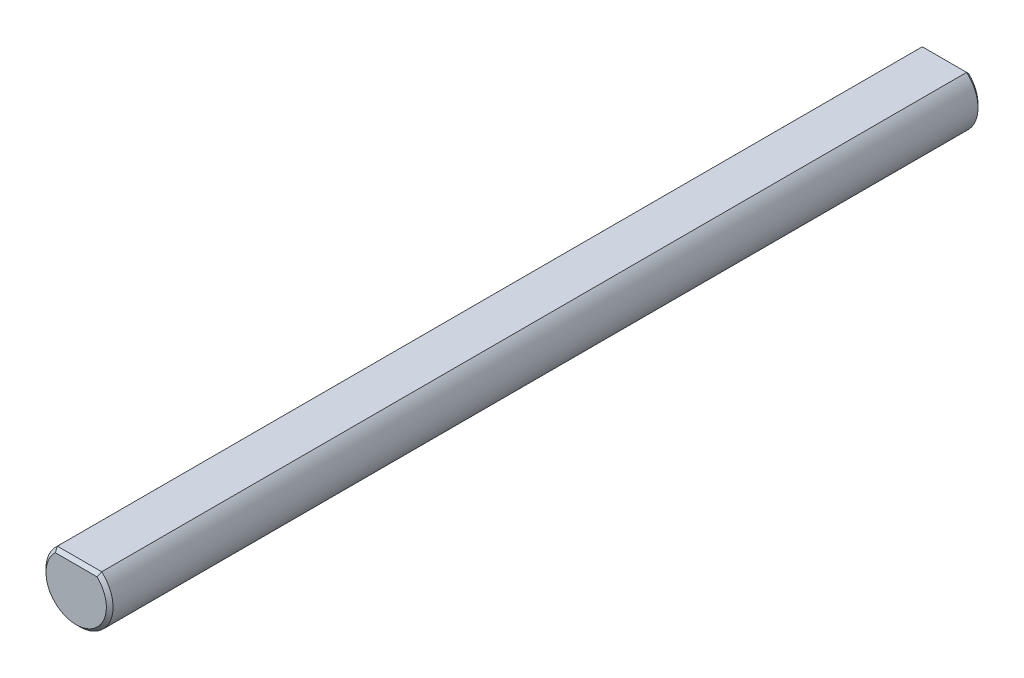
ISO-10303-21;
HEADER;
FILE_DESCRIPTION(('STEP AP214'),'2;1');
FILE_NAME('part.step','',(''),(''),'','','');
FILE_SCHEMA(('AUTOMOTIVE_DESIGN { 1 0 10303 214 1 1 1 1 }'));
ENDSEC;
DATA;
#1=APPLICATION_CONTEXT('core data for automotive mechanical design processes');
#2=APPLICATION_PROTOCOL_DEFINITION('international standard','automotive_design',2000,#1);
#3=PRODUCT_CONTEXT('',#1,'mechanical');
#4=PRODUCT('Part','Part','',(#3));
#5=PRODUCT_RELATED_PRODUCT_CATEGORY('part','',(#4));
#6=PRODUCT_DEFINITION_FORMATION('','',#4);
#7=PRODUCT_DEFINITION_CONTEXT('part definition',#1,'design');
#8=PRODUCT_DEFINITION('design','',#6,#7);
#9=PRODUCT_DEFINITION_SHAPE('','',#8);
#10=(LENGTH_UNIT() NAMED_UNIT(*) SI_UNIT(.MILLI.,.METRE.));
#11=(NAMED_UNIT(*) PLANE_ANGLE_UNIT() SI_UNIT($,.RADIAN.));
#12=(NAMED_UNIT(*) SI_UNIT($,.STERADIAN.) SOLID_ANGLE_UNIT());
#13=UNCERTAINTY_MEASURE_WITH_UNIT(LENGTH_MEASURE(1.E-05),#10,'distance_accuracy_value','');
#14=(GEOMETRIC_REPRESENTATION_CONTEXT(3) GLOBAL_UNCERTAINTY_ASSIGNED_CONTEXT((#13)) GLOBAL_UNIT_ASSIGNED_CONTEXT((#10,
#11,#12)) REPRESENTATION_CONTEXT('',''));
#15=CARTESIAN_POINT('',(0.,0.,0.));
#16=DIRECTION('',(0.,0.,1.));
#17=DIRECTION('',(1.,0.,0.));
#18=AXIS2_PLACEMENT_3D('',#15,#16,#17);
#19=CARTESIAN_POINT('',(0.,1.5,51.8));
#20=DIRECTION('',(0.,-0.707106781186535,-0.70710678118656));
#21=DIRECTION('',(0.,0.70710678118656,-0.707106781186535));
#22=AXIS2_PLACEMENT_3D('',#19,#20,#21);
#23=PLANE('',#22);
#24=CARTESIAN_POINT('',(-1.24498995975231,1.30000000000285,51.9999999999971));
#25=CARTESIAN_POINT('',(-1.25833682015107,1.33326211367377,51.9667378863262));
#26=CARTESIAN_POINT('',(-1.27150072999706,1.36655985042197,51.933440149578));
#27=CARTESIAN_POINT('',(-1.29746262799423,1.4332265172024,51.8667734827976));
#28=CARTESIAN_POINT('',(-1.31026061672577,1.46659544712162,51.8334045528784));
#29=CARTESIAN_POINT('',(-1.3228756554849,1.50000000000513,51.7999999999949));
#30=B_SPLINE_CURVE_WITH_KNOTS('',3,(#24,#25,#26,#27,#28,#29),.UNSPECIFIED.,.F.,.F.,(4,2,4),(0.,
0.146686412485427,0.293372592309323),.UNSPECIFIED.);
#31=CARTESIAN_POINT('',(-1.2449899597777,1.30000000000142,51.9999999999806));
#32=VERTEX_POINT('',#31);
#33=CARTESIAN_POINT('',(-1.32287565550833,1.50000000000262,51.7999999999974));
#34=VERTEX_POINT('',#33);
#35=EDGE_CURVE('E62',#32,#34,#30,.T.);
#36=ORIENTED_EDGE('',*,*,#35,.F.);
#37=DIRECTION('',(1.,0.,0.));
#38=VECTOR('',#37,1.);
#39=CARTESIAN_POINT('',(0.,1.29999999999999,52.));
#40=LINE('',#39,#38);
#41=CARTESIAN_POINT('',(1.2449899597777,1.30000000000142,51.9999999999806));
#42=VERTEX_POINT('',#41);
#43=EDGE_CURVE('E74',#42,#32,#40,.F.);
#44=ORIENTED_EDGE('',*,*,#43,.F.);
#45=CARTESIAN_POINT('',(1.32287565548253,1.50000000000036,51.7999999999996));
#46=CARTESIAN_POINT('',(1.31026061672388,1.46659544711763,51.8334045528824));
#47=CARTESIAN_POINT('',(1.29746262799282,1.43322651719918,51.8667734828008));
#48=CARTESIAN_POINT('',(1.27150072999658,1.36655985042032,51.9334401495797));
#49=CARTESIAN_POINT('',(1.25833682015104,1.3332621136729,51.9667378863271));
#50=CARTESIAN_POINT('',(1.24498995975273,1.30000000000277,51.9999999999972));
#51=B_SPLINE_CURVE_WITH_KNOTS('',3,(#45,#46,#47,#48,#49,#50),.UNSPECIFIED.,.F.,.F.,(4,2,4),(0.,
0.146686179820333,0.293372592302182),.UNSPECIFIED.);
#52=CARTESIAN_POINT('',(1.32287565549698,1.49999999999961,51.8000000000143));
#53=VERTEX_POINT('',#52);
#54=EDGE_CURVE('E20',#53,#42,#51,.T.);
#55=ORIENTED_EDGE('',*,*,#54,.F.);
#56=DIRECTION('',(1.,0.,0.));
#57=VECTOR('',#56,1.);
#58=CARTESIAN_POINT('',(0.,1.5,51.8));
#59=LINE('',#58,#57);
#60=EDGE_CURVE('E71',#34,#53,#59,.T.);
#61=ORIENTED_EDGE('',*,*,#60,.F.);
#62=EDGE_LOOP('',(#36,#44,#55,#61));
#63=FACE_BOUND('',#62,.T.);
#64=ADVANCED_FACE('F16',(#63),#23,.F.);
#65=CARTESIAN_POINT('',(0.,1.30000000000001,0.));
#66=DIRECTION('',(0.,0.70710678118656,-0.707106781186535));
#67=DIRECTION('',(0.,0.707106781186535,0.70710678118656));
#68=AXIS2_PLACEMENT_3D('',#65,#66,#67);
#69=PLANE('',#68);
#70=CARTESIAN_POINT('',(1.24498995972086,1.29999999999995,0.));
#71=CARTESIAN_POINT('',(1.2583368201331,1.33326211367092,0.0332621136709172));
#72=CARTESIAN_POINT('',(1.2715007299929,1.36655985041917,0.0665598504191619));
#73=CARTESIAN_POINT('',(1.2974626280183,1.43322651719964,0.133226517199637));
#74=CARTESIAN_POINT('',(1.31026061676427,1.46659544711887,0.166595447118863));
#75=CARTESIAN_POINT('',(1.32287565553815,1.50000000000235,0.20000000000235));
#76=B_SPLINE_CURVE_WITH_KNOTS('',3,(#70,#71,#72,#73,#74,#75),.UNSPECIFIED.,.F.,.F.,(4,2,4),(0.,
0.146686412496753,0.293372592331981),.UNSPECIFIED.);
#77=CARTESIAN_POINT('',(1.244989959721,1.29999999999986,0.));
#78=VERTEX_POINT('',#77);
#79=CARTESIAN_POINT('',(1.32287565553545,1.5,0.200000000000634));
#80=VERTEX_POINT('',#79);
#81=EDGE_CURVE('E103',#78,#80,#76,.T.);
#82=ORIENTED_EDGE('',*,*,#81,.F.);
#83=DIRECTION('',(1.,0.,0.));
#84=VECTOR('',#83,1.);
#85=CARTESIAN_POINT('',(0.,1.29999999999977,0.));
#86=LINE('',#85,#84);
#87=CARTESIAN_POINT('',(-1.244989959721,1.29999999999986,0.));
#88=VERTEX_POINT('',#87);
#89=EDGE_CURVE('E87',#78,#88,#86,.F.);
#90=ORIENTED_EDGE('',*,*,#89,.T.);
#91=CARTESIAN_POINT('',(-1.32287565553794,1.50000000000331,0.200000000003304));
#92=CARTESIAN_POINT('',(-1.3102606167642,1.46659544711964,0.166595447119638));
#93=CARTESIAN_POINT('',(-1.29746262801836,1.43322651720024,0.133226517200236));
#94=CARTESIAN_POINT('',(-1.27150072999317,1.36655985041942,0.0665598504194163));
#95=CARTESIAN_POINT('',(-1.25833682013346,1.33326211367101,0.0332621136710032));
#96=CARTESIAN_POINT('',(-1.24498995972128,1.29999999999987,-1.41837202161552E-13));
#97=B_SPLINE_CURVE_WITH_KNOTS('',3,(#91,#92,#93,#94,#95,#96),.UNSPECIFIED.,.F.,.F.,(4,2,4),(0.,
0.146686179835851,0.293372592333224),.UNSPECIFIED.);
#98=CARTESIAN_POINT('',(-1.3228756555281,1.50000000000784,0.200000000002245));
#99=VERTEX_POINT('',#98);
#100=EDGE_CURVE('E91',#99,#88,#97,.T.);
#101=ORIENTED_EDGE('',*,*,#100,.F.);
#102=DIRECTION('',(1.,0.,0.));
#103=VECTOR('',#102,1.);
#104=CARTESIAN_POINT('',(0.,1.5,0.200000000001269));
#105=LINE('',#104,#103);
#106=EDGE_CURVE('E82',#80,#99,#105,.F.);
#107=ORIENTED_EDGE('',*,*,#106,.F.);
#108=EDGE_LOOP('',(#82,#90,#101,#107));
#109=FACE_BOUND('',#108,.T.);
#110=ADVANCED_FACE('F111',(#109),#69,.T.);
#111=CARTESIAN_POINT('',(0.,0.,52.));
#112=DIRECTION('',(0.,0.,1.));
#113=DIRECTION('',(1.,0.,0.));
#114=AXIS2_PLACEMENT_3D('',#111,#112,#113);
#115=PLANE('',#114);
#116=CARTESIAN_POINT('',(0.,0.,51.9999999999641));
#117=DIRECTION('',(0.,0.,-1.));
#118=DIRECTION('',(-1.,0.,0.));
#119=AXIS2_PLACEMENT_3D('',#116,#117,#118);
#120=CIRCLE('',#119,1.80000000000291);
#121=EDGE_CURVE('E86',#42,#32,#120,.T.);
#122=ORIENTED_EDGE('',*,*,#121,.F.);
#123=ORIENTED_EDGE('',*,*,#43,.T.);
#124=EDGE_LOOP('',(#122,#123));
#125=FACE_BOUND('',#124,.T.);
#126=ADVANCED_FACE('F115',(#125),#115,.T.);
#127=CARTESIAN_POINT('',(0.,1.5,52.));
#128=DIRECTION('',(0.,1.,0.));
#129=DIRECTION('',(0.,0.,1.));
#130=AXIS2_PLACEMENT_3D('',#127,#128,#129);
#131=PLANE('',#130);
#132=DIRECTION('',(0.,0.,-1.));
#133=VECTOR('',#132,1.);
#134=CARTESIAN_POINT('',(1.32287565553317,1.49999999999923,52.));
#135=LINE('',#134,#133);
#136=EDGE_CURVE('E80',#80,#53,#135,.F.);
#137=ORIENTED_EDGE('',*,*,#136,.F.);
#138=ORIENTED_EDGE('',*,*,#106,.T.);
#139=DIRECTION('',(0.,0.,-1.));
#140=VECTOR('',#139,1.);
#141=CARTESIAN_POINT('',(-1.32287565551826,1.50000000001238,52.));
#142=LINE('',#141,#140);
#143=EDGE_CURVE('E81',#34,#99,#142,.T.);
#144=ORIENTED_EDGE('',*,*,#143,.F.);
#145=ORIENTED_EDGE('',*,*,#60,.T.);
#146=EDGE_LOOP('',(#137,#138,#144,#145));
#147=FACE_BOUND('',#146,.T.);
#148=ADVANCED_FACE('F78',(#147),#131,.T.);
#149=CARTESIAN_POINT('',(0.,0.,0.));
#150=DIRECTION('',(0.,0.,1.));
#151=DIRECTION('',(1.,0.,0.));
#152=AXIS2_PLACEMENT_3D('',#149,#150,#151);
#153=PLANE('',#152);
#154=ORIENTED_EDGE('',*,*,#89,.F.);
#155=CARTESIAN_POINT('',(0.,0.,0.));
#156=DIRECTION('',(0.,0.,1.));
#157=DIRECTION('',(1.,0.,0.));
#158=AXIS2_PLACEMENT_3D('',#155,#156,#157);
#159=CIRCLE('',#158,1.79999999994607);
#160=EDGE_CURVE('E67',#88,#78,#159,.T.);
#161=ORIENTED_EDGE('',*,*,#160,.F.);
#162=EDGE_LOOP('',(#154,#161));
#163=FACE_BOUND('',#162,.T.);
#164=ADVANCED_FACE('F123',(#163),#153,.F.);
#165=CARTESIAN_POINT('',(0.,0.,51.8000000001848));
#166=DIRECTION('',(0.,0.,-1.));
#167=DIRECTION('',(-1.,0.,0.));
#168=AXIS2_PLACEMENT_3D('',#165,#166,#167);
#169=CONICAL_SURFACE('',#168,1.99999999978218,0.785398163397448);
#170=CARTESIAN_POINT('',(0.,0.,51.8));
#171=DIRECTION('',(0.,0.,-1.));
#172=DIRECTION('',(-1.,0.,0.));
#173=AXIS2_PLACEMENT_3D('',#170,#171,#172);
#174=CIRCLE('',#173,2.);
#175=EDGE_CURVE('E31',#53,#34,#174,.T.);
#176=ORIENTED_EDGE('',*,*,#175,.F.);
#177=ORIENTED_EDGE('',*,*,#54,.T.);
#178=ORIENTED_EDGE('',*,*,#121,.T.);
#179=ORIENTED_EDGE('',*,*,#35,.T.);
#180=EDGE_LOOP('',(#176,#177,#178,#179));
#181=FACE_BOUND('',#180,.T.);
#182=ADVANCED_FACE('F59',(#181),#169,.T.);
#183=CARTESIAN_POINT('',(0.,0.,0.200000000006639));
#184=DIRECTION('',(0.,0.,1.));
#185=DIRECTION('',(1.,0.,0.));
#186=AXIS2_PLACEMENT_3D('',#183,#184,#185);
#187=CONICAL_SURFACE('',#186,2.00000000000955,0.785398163539557);
#188=ORIENTED_EDGE('',*,*,#160,.T.);
#189=ORIENTED_EDGE('',*,*,#81,.T.);
#190=CARTESIAN_POINT('',(0.,0.,0.199999999999999));
#191=DIRECTION('',(0.,0.,-1.));
#192=DIRECTION('',(-1.,0.,0.));
#193=AXIS2_PLACEMENT_3D('',#190,#191,#192);
#194=CIRCLE('',#193,2.);
#195=EDGE_CURVE('E11',#99,#80,#194,.F.);
#196=ORIENTED_EDGE('',*,*,#195,.F.);
#197=ORIENTED_EDGE('',*,*,#100,.T.);
#198=EDGE_LOOP('',(#188,#189,#196,#197));
#199=FACE_BOUND('',#198,.T.);
#200=ADVANCED_FACE('F108',(#199),#187,.T.);
#201=CARTESIAN_POINT('',(0.,0.,52.));
#202=DIRECTION('',(0.,0.,-1.));
#203=DIRECTION('',(-1.,0.,0.));
#204=AXIS2_PLACEMENT_3D('',#201,#202,#203);
#205=CYLINDRICAL_SURFACE('',#204,2.);
#206=ORIENTED_EDGE('',*,*,#175,.T.);
#207=ORIENTED_EDGE('',*,*,#143,.T.);
#208=ORIENTED_EDGE('',*,*,#195,.T.);
#209=ORIENTED_EDGE('',*,*,#136,.T.);
#210=EDGE_LOOP('',(#206,#207,#208,#209));
#211=FACE_BOUND('',#210,.T.);
#212=ADVANCED_FACE('F84',(#211),#205,.T.);
#213=CLOSED_SHELL('',(#64,#110,#126,#148,#164,#182,#200,#212));
#214=MANIFOLD_SOLID_BREP('B1',#213);
#215=ADVANCED_BREP_SHAPE_REPRESENTATION('',(#18,#214),#14);
#216=SHAPE_DEFINITION_REPRESENTATION(#9,#215);
ENDSEC;
END-ISO-10303-21;
